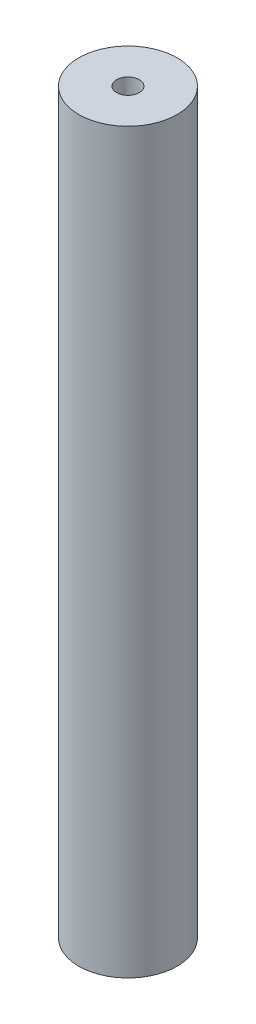
ISO-10303-21;
HEADER;
FILE_DESCRIPTION(('STEP AP214'),'2;1');
FILE_NAME('part.step','',(''),(''),'','','');
FILE_SCHEMA(('AUTOMOTIVE_DESIGN { 1 0 10303 214 1 1 1 1 }'));
ENDSEC;
DATA;
#1=APPLICATION_CONTEXT('core data for automotive mechanical design processes');
#2=APPLICATION_PROTOCOL_DEFINITION('international standard','automotive_design',2000,#1);
#3=PRODUCT_CONTEXT('',#1,'mechanical');
#4=PRODUCT('Part','Part','',(#3));
#5=PRODUCT_RELATED_PRODUCT_CATEGORY('part','',(#4));
#6=PRODUCT_DEFINITION_FORMATION('','',#4);
#7=PRODUCT_DEFINITION_CONTEXT('part definition',#1,'design');
#8=PRODUCT_DEFINITION('design','',#6,#7);
#9=PRODUCT_DEFINITION_SHAPE('','',#8);
#10=(LENGTH_UNIT() NAMED_UNIT(*) SI_UNIT(.MILLI.,.METRE.));
#11=(NAMED_UNIT(*) PLANE_ANGLE_UNIT() SI_UNIT($,.RADIAN.));
#12=(NAMED_UNIT(*) SI_UNIT($,.STERADIAN.) SOLID_ANGLE_UNIT());
#13=UNCERTAINTY_MEASURE_WITH_UNIT(LENGTH_MEASURE(1.E-05),#10,'distance_accuracy_value','');
#14=(GEOMETRIC_REPRESENTATION_CONTEXT(3) GLOBAL_UNCERTAINTY_ASSIGNED_CONTEXT((#13)) GLOBAL_UNIT_ASSIGNED_CONTEXT((#10,
#11,#12)) REPRESENTATION_CONTEXT('',''));
#15=CARTESIAN_POINT('',(0.,0.,0.));
#16=DIRECTION('',(0.,0.,1.));
#17=DIRECTION('',(1.,0.,0.));
#18=AXIS2_PLACEMENT_3D('',#15,#16,#17);
#19=CARTESIAN_POINT('',(0.,75.,0.));
#20=DIRECTION('',(0.,1.,0.));
#21=DIRECTION('',(0.,0.,1.));
#22=AXIS2_PLACEMENT_3D('',#19,#20,#21);
#23=PLANE('',#22);
#24=CARTESIAN_POINT('',(0.,75.,0.));
#25=DIRECTION('',(0.,1.,0.));
#26=DIRECTION('',(0.,0.,1.));
#27=AXIS2_PLACEMENT_3D('',#24,#25,#26);
#28=CIRCLE('',#27,5.);
#29=CARTESIAN_POINT('',(0.,75.,5.));
#30=VERTEX_POINT('',#29);
#31=EDGE_CURVE('E10',#30,#30,#28,.T.);
#32=ORIENTED_EDGE('',*,*,#31,.T.);
#33=EDGE_LOOP('',(#32));
#34=FACE_BOUND('',#33,.T.);
#35=CARTESIAN_POINT('',(0.,75.,0.));
#36=DIRECTION('',(0.,1.,0.));
#37=DIRECTION('',(0.,0.,1.));
#38=AXIS2_PLACEMENT_3D('',#35,#36,#37);
#39=CIRCLE('',#38,1.15);
#40=CARTESIAN_POINT('',(0.,75.,1.15));
#41=VERTEX_POINT('',#40);
#42=EDGE_CURVE('E50',#41,#41,#39,.T.);
#43=ORIENTED_EDGE('',*,*,#42,.F.);
#44=EDGE_LOOP('',(#43));
#45=FACE_BOUND('',#44,.T.);
#46=ADVANCED_FACE('F37',(#34,#45),#23,.T.);
#47=CARTESIAN_POINT('',(0.,0.,0.));
#48=DIRECTION('',(0.,1.,0.));
#49=DIRECTION('',(0.,0.,1.));
#50=AXIS2_PLACEMENT_3D('',#47,#48,#49);
#51=PLANE('',#50);
#52=CARTESIAN_POINT('',(0.,0.,0.));
#53=DIRECTION('',(0.,1.,0.));
#54=DIRECTION('',(0.,0.,1.));
#55=AXIS2_PLACEMENT_3D('',#52,#53,#54);
#56=CIRCLE('',#55,5.);
#57=CARTESIAN_POINT('',(0.,0.,5.));
#58=VERTEX_POINT('',#57);
#59=EDGE_CURVE('E41',#58,#58,#56,.T.);
#60=ORIENTED_EDGE('',*,*,#59,.F.);
#61=EDGE_LOOP('',(#60));
#62=FACE_BOUND('',#61,.T.);
#63=CARTESIAN_POINT('',(0.,0.,0.));
#64=DIRECTION('',(0.,1.,0.));
#65=DIRECTION('',(0.,0.,1.));
#66=AXIS2_PLACEMENT_3D('',#63,#64,#65);
#67=CIRCLE('',#66,1.15);
#68=CARTESIAN_POINT('',(0.,0.,1.15));
#69=VERTEX_POINT('',#68);
#70=EDGE_CURVE('E52',#69,#69,#67,.T.);
#71=ORIENTED_EDGE('',*,*,#70,.T.);
#72=EDGE_LOOP('',(#71));
#73=FACE_BOUND('',#72,.T.);
#74=ADVANCED_FACE('F64',(#62,#73),#51,.F.);
#75=CARTESIAN_POINT('',(0.,75.,0.));
#76=DIRECTION('',(0.,-1.,0.));
#77=DIRECTION('',(0.,0.,-1.));
#78=AXIS2_PLACEMENT_3D('',#75,#76,#77);
#79=CYLINDRICAL_SURFACE('',#78,5.);
#80=ORIENTED_EDGE('',*,*,#31,.F.);
#81=EDGE_LOOP('',(#80));
#82=FACE_BOUND('',#81,.T.);
#83=ORIENTED_EDGE('',*,*,#59,.T.);
#84=EDGE_LOOP('',(#83));
#85=FACE_BOUND('',#84,.T.);
#86=ADVANCED_FACE('F39',(#82,#85),#79,.T.);
#87=CARTESIAN_POINT('',(0.,75.,0.));
#88=DIRECTION('',(0.,-1.,0.));
#89=DIRECTION('',(0.,0.,-1.));
#90=AXIS2_PLACEMENT_3D('',#87,#88,#89);
#91=CYLINDRICAL_SURFACE('',#90,1.15);
#92=ORIENTED_EDGE('',*,*,#42,.T.);
#93=EDGE_LOOP('',(#92));
#94=FACE_BOUND('',#93,.T.);
#95=ORIENTED_EDGE('',*,*,#70,.F.);
#96=EDGE_LOOP('',(#95));
#97=FACE_BOUND('',#96,.T.);
#98=ADVANCED_FACE('F60',(#94,#97),#91,.F.);
#99=CLOSED_SHELL('',(#46,#74,#86,#98));
#100=MANIFOLD_SOLID_BREP('B2',#99);
#101=ADVANCED_BREP_SHAPE_REPRESENTATION('',(#18,#100),#14);
#102=SHAPE_DEFINITION_REPRESENTATION(#9,#101);
ENDSEC;
END-ISO-10303-21;
